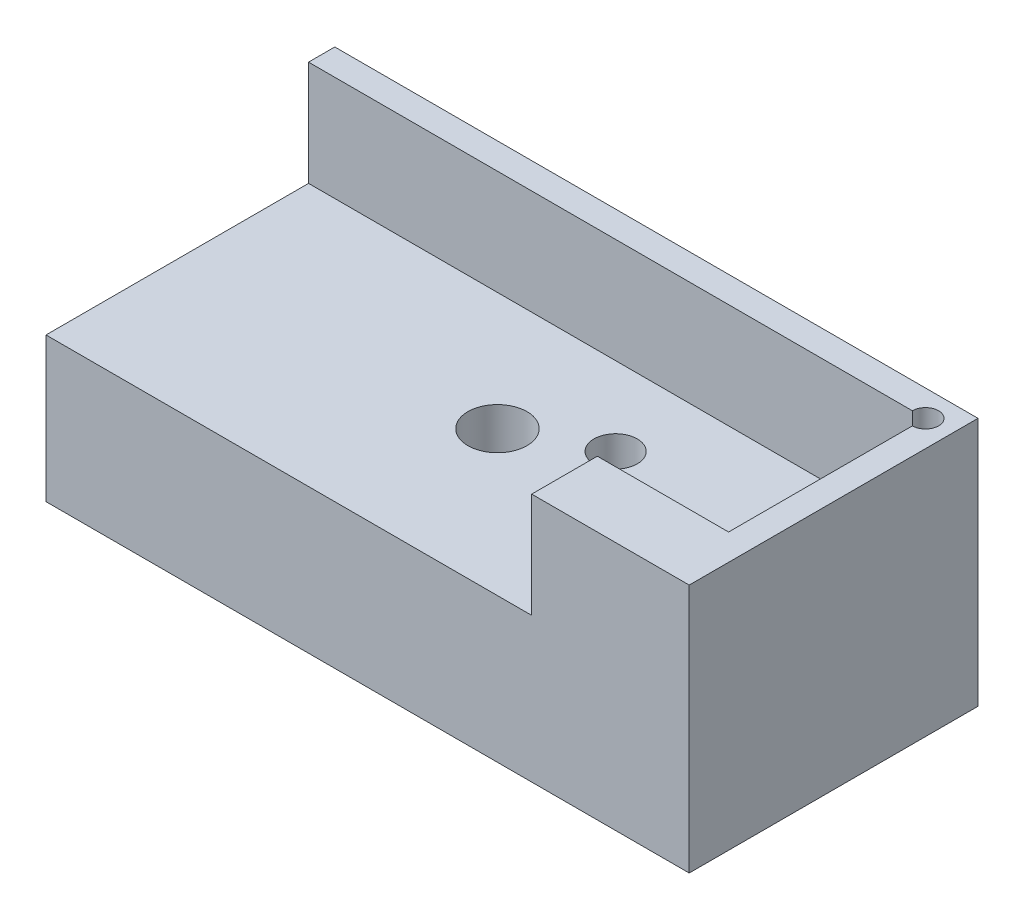
ISO-10303-21;
HEADER;
FILE_DESCRIPTION(('STEP AP214'),'2;1');
FILE_NAME('part.step','',(''),(''),'','','');
FILE_SCHEMA(('AUTOMOTIVE_DESIGN { 1 0 10303 214 1 1 1 1 }'));
ENDSEC;
DATA;
#1=APPLICATION_CONTEXT('core data for automotive mechanical design processes');
#2=APPLICATION_PROTOCOL_DEFINITION('international standard','automotive_design',2000,#1);
#3=PRODUCT_CONTEXT('',#1,'mechanical');
#4=PRODUCT('Part','Part','',(#3));
#5=PRODUCT_RELATED_PRODUCT_CATEGORY('part','',(#4));
#6=PRODUCT_DEFINITION_FORMATION('','',#4);
#7=PRODUCT_DEFINITION_CONTEXT('part definition',#1,'design');
#8=PRODUCT_DEFINITION('design','',#6,#7);
#9=PRODUCT_DEFINITION_SHAPE('','',#8);
#10=(LENGTH_UNIT() NAMED_UNIT(*) SI_UNIT(.MILLI.,.METRE.));
#11=(NAMED_UNIT(*) PLANE_ANGLE_UNIT() SI_UNIT($,.RADIAN.));
#12=(NAMED_UNIT(*) SI_UNIT($,.STERADIAN.) SOLID_ANGLE_UNIT());
#13=UNCERTAINTY_MEASURE_WITH_UNIT(LENGTH_MEASURE(1.E-05),#10,'distance_accuracy_value','');
#14=(GEOMETRIC_REPRESENTATION_CONTEXT(3) GLOBAL_UNCERTAINTY_ASSIGNED_CONTEXT((#13)) GLOBAL_UNIT_ASSIGNED_CONTEXT((#10,
#11,#12)) REPRESENTATION_CONTEXT('',''));
#15=CARTESIAN_POINT('',(0.,0.,0.));
#16=DIRECTION('',(0.,0.,1.));
#17=DIRECTION('',(1.,0.,0.));
#18=AXIS2_PLACEMENT_3D('',#15,#16,#17);
#19=CARTESIAN_POINT('',(0.,6.,0.));
#20=DIRECTION('',(0.,1.,0.));
#21=DIRECTION('',(0.,0.,1.));
#22=AXIS2_PLACEMENT_3D('',#19,#20,#21);
#23=PLANE('',#22);
#24=CARTESIAN_POINT('',(5.87799999999999,6.,-3.01448924411358));
#25=DIRECTION('',(0.,1.,0.));
#26=DIRECTION('',(0.,0.,1.));
#27=AXIS2_PLACEMENT_3D('',#24,#25,#26);
#28=CIRCLE('',#27,1.65);
#29=CARTESIAN_POINT('',(5.87799999999999,6.,-1.36448924411358));
#30=VERTEX_POINT('',#29);
#31=EDGE_CURVE('E183',#30,#30,#28,.T.);
#32=ORIENTED_EDGE('',*,*,#31,.F.);
#33=EDGE_LOOP('',(#32));
#34=FACE_BOUND('',#33,.T.);
#35=CARTESIAN_POINT('',(-0.121999999999988,6.,-0.0144892441135873));
#36=DIRECTION('',(0.,1.,0.));
#37=DIRECTION('',(0.,0.,1.));
#38=AXIS2_PLACEMENT_3D('',#35,#36,#37);
#39=CIRCLE('',#38,2.25);
#40=CARTESIAN_POINT('',(-0.121999999999988,6.,2.23551075588641));
#41=VERTEX_POINT('',#40);
#42=EDGE_CURVE('E157',#41,#41,#39,.T.);
#43=ORIENTED_EDGE('',*,*,#42,.F.);
#44=EDGE_LOOP('',(#43));
#45=FACE_BOUND('',#44,.T.);
#46=DIRECTION('',(0.,0.,-1.));
#47=VECTOR('',#46,1.);
#48=CARTESIAN_POINT('',(23.5,6.,-9.));
#49=LINE('',#48,#47);
#50=CARTESIAN_POINT('',(23.5,6.,6.));
#51=VERTEX_POINT('',#50);
#52=CARTESIAN_POINT('',(23.5,6.,-8.));
#53=VERTEX_POINT('',#52);
#54=EDGE_CURVE('E260',#51,#53,#49,.T.);
#55=ORIENTED_EDGE('',*,*,#54,.T.);
#56=CARTESIAN_POINT('',(23.5,6.,-9.));
#57=DIRECTION('',(0.,1.,0.));
#58=DIRECTION('',(0.,0.,1.));
#59=AXIS2_PLACEMENT_3D('',#56,#57,#58);
#60=CIRCLE('',#59,1.);
#61=CARTESIAN_POINT('',(22.5,6.,-9.));
#62=VERTEX_POINT('',#61);
#63=EDGE_CURVE('E201',#62,#53,#60,.F.);
#64=ORIENTED_EDGE('',*,*,#63,.F.);
#65=DIRECTION('',(-1.,0.,0.));
#66=VECTOR('',#65,1.);
#67=CARTESIAN_POINT('',(-23.5,6.,-9.));
#68=LINE('',#67,#66);
#69=CARTESIAN_POINT('',(-23.5,6.,-9.));
#70=VERTEX_POINT('',#69);
#71=EDGE_CURVE('E272',#62,#70,#68,.T.);
#72=ORIENTED_EDGE('',*,*,#71,.T.);
#73=DIRECTION('',(0.,0.,1.));
#74=VECTOR('',#73,1.);
#75=CARTESIAN_POINT('',(-23.5,6.,-9.));
#76=LINE('',#75,#74);
#77=CARTESIAN_POINT('',(-23.5,6.,11.));
#78=VERTEX_POINT('',#77);
#79=EDGE_CURVE('E274',#70,#78,#76,.T.);
#80=ORIENTED_EDGE('',*,*,#79,.T.);
#81=DIRECTION('',(-1.,0.,0.));
#82=VECTOR('',#81,1.);
#83=CARTESIAN_POINT('',(31.7462112512353,6.,11.));
#84=LINE('',#83,#82);
#85=CARTESIAN_POINT('',(13.5,6.,11.));
#86=VERTEX_POINT('',#85);
#87=EDGE_CURVE('E217',#86,#78,#84,.T.);
#88=ORIENTED_EDGE('',*,*,#87,.F.);
#89=DIRECTION('',(0.,0.,-1.));
#90=VECTOR('',#89,1.);
#91=CARTESIAN_POINT('',(13.5,6.,9.));
#92=LINE('',#91,#90);
#93=CARTESIAN_POINT('',(13.5,6.,6.));
#94=VERTEX_POINT('',#93);
#95=EDGE_CURVE('E224',#86,#94,#92,.T.);
#96=ORIENTED_EDGE('',*,*,#95,.T.);
#97=DIRECTION('',(-1.,0.,0.));
#98=VECTOR('',#97,1.);
#99=CARTESIAN_POINT('',(23.5,6.,6.));
#100=LINE('',#99,#98);
#101=EDGE_CURVE('E208',#51,#94,#100,.T.);
#102=ORIENTED_EDGE('',*,*,#101,.F.);
#103=EDGE_LOOP('',(#55,#64,#72,#80,#88,#96,#102));
#104=FACE_BOUND('',#103,.T.);
#105=ADVANCED_FACE('F40',(#34,#45,#104),#23,.T.);
#106=CARTESIAN_POINT('',(0.,14.,0.));
#107=DIRECTION('',(0.,1.,0.));
#108=DIRECTION('',(0.,0.,1.));
#109=AXIS2_PLACEMENT_3D('',#106,#107,#108);
#110=PLANE('',#109);
#111=CARTESIAN_POINT('',(23.5,14.,-9.));
#112=DIRECTION('',(0.,1.,0.));
#113=DIRECTION('',(0.,0.,1.));
#114=AXIS2_PLACEMENT_3D('',#111,#112,#113);
#115=CIRCLE('',#114,1.);
#116=CARTESIAN_POINT('',(23.5,14.,-8.));
#117=VERTEX_POINT('',#116);
#118=CARTESIAN_POINT('',(22.5,14.,-9.));
#119=VERTEX_POINT('',#118);
#120=EDGE_CURVE('E199',#117,#119,#115,.T.);
#121=ORIENTED_EDGE('',*,*,#120,.F.);
#122=DIRECTION('',(0.,0.,1.));
#123=VECTOR('',#122,1.);
#124=CARTESIAN_POINT('',(23.5,14.,9.));
#125=LINE('',#124,#123);
#126=CARTESIAN_POINT('',(23.5,14.,6.));
#127=VERTEX_POINT('',#126);
#128=EDGE_CURVE('E247',#117,#127,#125,.T.);
#129=ORIENTED_EDGE('',*,*,#128,.T.);
#130=DIRECTION('',(1.,0.,0.));
#131=VECTOR('',#130,1.);
#132=CARTESIAN_POINT('',(13.5,14.,6.));
#133=LINE('',#132,#131);
#134=CARTESIAN_POINT('',(13.5,14.,6.));
#135=VERTEX_POINT('',#134);
#136=EDGE_CURVE('E214',#135,#127,#133,.T.);
#137=ORIENTED_EDGE('',*,*,#136,.F.);
#138=DIRECTION('',(0.,0.,1.));
#139=VECTOR('',#138,1.);
#140=CARTESIAN_POINT('',(13.5,14.,9.));
#141=LINE('',#140,#139);
#142=CARTESIAN_POINT('',(13.5,14.,11.));
#143=VERTEX_POINT('',#142);
#144=EDGE_CURVE('E221',#135,#143,#141,.T.);
#145=ORIENTED_EDGE('',*,*,#144,.T.);
#146=DIRECTION('',(1.,0.,0.));
#147=VECTOR('',#146,1.);
#148=CARTESIAN_POINT('',(-23.5,14.,11.));
#149=LINE('',#148,#147);
#150=CARTESIAN_POINT('',(25.5,14.,11.));
#151=VERTEX_POINT('',#150);
#152=EDGE_CURVE('E249',#143,#151,#149,.T.);
#153=ORIENTED_EDGE('',*,*,#152,.T.);
#154=DIRECTION('',(0.,0.,-1.));
#155=VECTOR('',#154,1.);
#156=CARTESIAN_POINT('',(25.5,14.,11.));
#157=LINE('',#156,#155);
#158=CARTESIAN_POINT('',(25.5,14.,-11.));
#159=VERTEX_POINT('',#158);
#160=EDGE_CURVE('E251',#151,#159,#157,.T.);
#161=ORIENTED_EDGE('',*,*,#160,.T.);
#162=DIRECTION('',(-1.,0.,0.));
#163=VECTOR('',#162,1.);
#164=CARTESIAN_POINT('',(25.5,14.,-11.));
#165=LINE('',#164,#163);
#166=CARTESIAN_POINT('',(-23.5,14.,-11.));
#167=VERTEX_POINT('',#166);
#168=EDGE_CURVE('E254',#159,#167,#165,.T.);
#169=ORIENTED_EDGE('',*,*,#168,.T.);
#170=DIRECTION('',(0.,0.,1.));
#171=VECTOR('',#170,1.);
#172=CARTESIAN_POINT('',(-23.5,14.,-9.));
#173=LINE('',#172,#171);
#174=CARTESIAN_POINT('',(-23.5,14.,-9.));
#175=VERTEX_POINT('',#174);
#176=EDGE_CURVE('E241',#167,#175,#173,.T.);
#177=ORIENTED_EDGE('',*,*,#176,.T.);
#178=DIRECTION('',(1.,0.,0.));
#179=VECTOR('',#178,1.);
#180=CARTESIAN_POINT('',(23.5,14.,-9.));
#181=LINE('',#180,#179);
#182=EDGE_CURVE('E244',#175,#119,#181,.T.);
#183=ORIENTED_EDGE('',*,*,#182,.T.);
#184=EDGE_LOOP('',(#121,#129,#137,#145,#153,#161,#169,#177,#183));
#185=FACE_BOUND('',#184,.T.);
#186=ADVANCED_FACE('F313',(#185),#110,.T.);
#187=CARTESIAN_POINT('',(-23.5,6.,-9.));
#188=DIRECTION('',(1.,0.,0.));
#189=DIRECTION('',(0.,0.,-1.));
#190=AXIS2_PLACEMENT_3D('',#187,#188,#189);
#191=PLANE('',#190);
#192=DIRECTION('',(0.,1.,0.));
#193=VECTOR('',#192,1.);
#194=CARTESIAN_POINT('',(-23.5,0.,11.));
#195=LINE('',#194,#193);
#196=CARTESIAN_POINT('',(-23.5,-5.,11.));
#197=VERTEX_POINT('',#196);
#198=EDGE_CURVE('E266',#197,#78,#195,.T.);
#199=ORIENTED_EDGE('',*,*,#198,.T.);
#200=ORIENTED_EDGE('',*,*,#79,.F.);
#201=DIRECTION('',(0.,1.,0.));
#202=VECTOR('',#201,1.);
#203=CARTESIAN_POINT('',(-23.5,0.,-9.));
#204=LINE('',#203,#202);
#205=EDGE_CURVE('E257',#70,#175,#204,.T.);
#206=ORIENTED_EDGE('',*,*,#205,.T.);
#207=ORIENTED_EDGE('',*,*,#176,.F.);
#208=DIRECTION('',(0.,1.,0.));
#209=VECTOR('',#208,1.);
#210=CARTESIAN_POINT('',(-23.5,0.,-11.));
#211=LINE('',#210,#209);
#212=CARTESIAN_POINT('',(-23.5,-5.,-11.));
#213=VERTEX_POINT('',#212);
#214=EDGE_CURVE('E258',#213,#167,#211,.T.);
#215=ORIENTED_EDGE('',*,*,#214,.F.);
#216=DIRECTION('',(0.,0.,1.));
#217=VECTOR('',#216,1.);
#218=CARTESIAN_POINT('',(-23.5,-5.,-11.));
#219=LINE('',#218,#217);
#220=EDGE_CURVE('E235',#213,#197,#219,.T.);
#221=ORIENTED_EDGE('',*,*,#220,.T.);
#222=EDGE_LOOP('',(#199,#200,#206,#207,#215,#221));
#223=FACE_BOUND('',#222,.T.);
#224=ADVANCED_FACE('F319',(#223),#191,.F.);
#225=CARTESIAN_POINT('',(25.5,0.,-11.));
#226=DIRECTION('',(0.,0.,-1.));
#227=DIRECTION('',(-1.,0.,0.));
#228=AXIS2_PLACEMENT_3D('',#225,#226,#227);
#229=PLANE('',#228);
#230=DIRECTION('',(0.,-1.,0.));
#231=VECTOR('',#230,1.);
#232=CARTESIAN_POINT('',(18.878,-2.15599999999999,-11.));
#233=LINE('',#232,#231);
#234=CARTESIAN_POINT('',(18.878,-2.15599999999999,-11.));
#235=VERTEX_POINT('',#234);
#236=CARTESIAN_POINT('',(18.878,-5.,-11.));
#237=VERTEX_POINT('',#236);
#238=EDGE_CURVE('E166',#235,#237,#233,.T.);
#239=ORIENTED_EDGE('',*,*,#238,.F.);
#240=DIRECTION('',(1.,0.,0.));
#241=VECTOR('',#240,1.);
#242=CARTESIAN_POINT('',(25.5,-2.15599999999999,-11.));
#243=LINE('',#242,#241);
#244=CARTESIAN_POINT('',(-6.62200000000001,-2.15599999999999,-11.));
#245=VERTEX_POINT('',#244);
#246=EDGE_CURVE('E279',#245,#235,#243,.T.);
#247=ORIENTED_EDGE('',*,*,#246,.F.);
#248=DIRECTION('',(0.,1.,0.));
#249=VECTOR('',#248,1.);
#250=CARTESIAN_POINT('',(-6.62200000000001,0.,-11.));
#251=LINE('',#250,#249);
#252=CARTESIAN_POINT('',(-6.62200000000001,-5.,-11.));
#253=VERTEX_POINT('',#252);
#254=EDGE_CURVE('E196',#253,#245,#251,.T.);
#255=ORIENTED_EDGE('',*,*,#254,.F.);
#256=DIRECTION('',(-1.,0.,0.));
#257=VECTOR('',#256,1.);
#258=CARTESIAN_POINT('',(25.5,-5.,-11.));
#259=LINE('',#258,#257);
#260=EDGE_CURVE('E231',#253,#213,#259,.T.);
#261=ORIENTED_EDGE('',*,*,#260,.T.);
#262=ORIENTED_EDGE('',*,*,#214,.T.);
#263=ORIENTED_EDGE('',*,*,#168,.F.);
#264=DIRECTION('',(0.,1.,0.));
#265=VECTOR('',#264,1.);
#266=CARTESIAN_POINT('',(25.5,0.,-11.));
#267=LINE('',#266,#265);
#268=CARTESIAN_POINT('',(25.5,-5.,-11.));
#269=VERTEX_POINT('',#268);
#270=EDGE_CURVE('E261',#269,#159,#267,.T.);
#271=ORIENTED_EDGE('',*,*,#270,.F.);
#272=EDGE_CURVE('E232',#269,#237,#259,.T.);
#273=ORIENTED_EDGE('',*,*,#272,.T.);
#274=EDGE_LOOP('',(#239,#247,#255,#261,#262,#263,#271,#273));
#275=FACE_BOUND('',#274,.T.);
#276=ADVANCED_FACE('F304',(#275),#229,.T.);
#277=CARTESIAN_POINT('',(25.5,0.,11.));
#278=DIRECTION('',(1.,0.,0.));
#279=DIRECTION('',(0.,0.,-1.));
#280=AXIS2_PLACEMENT_3D('',#277,#278,#279);
#281=PLANE('',#280);
#282=ORIENTED_EDGE('',*,*,#270,.T.);
#283=ORIENTED_EDGE('',*,*,#160,.F.);
#284=DIRECTION('',(0.,1.,0.));
#285=VECTOR('',#284,1.);
#286=CARTESIAN_POINT('',(25.5,0.,11.));
#287=LINE('',#286,#285);
#288=CARTESIAN_POINT('',(25.5,-5.,11.));
#289=VERTEX_POINT('',#288);
#290=EDGE_CURVE('E263',#289,#151,#287,.T.);
#291=ORIENTED_EDGE('',*,*,#290,.F.);
#292=DIRECTION('',(0.,0.,-1.));
#293=VECTOR('',#292,1.);
#294=CARTESIAN_POINT('',(25.5,-5.,11.));
#295=LINE('',#294,#293);
#296=EDGE_CURVE('E228',#289,#269,#295,.T.);
#297=ORIENTED_EDGE('',*,*,#296,.T.);
#298=EDGE_LOOP('',(#282,#283,#291,#297));
#299=FACE_BOUND('',#298,.T.);
#300=ADVANCED_FACE('F332',(#299),#281,.T.);
#301=CARTESIAN_POINT('',(-23.5,0.,11.));
#302=DIRECTION('',(0.,0.,1.));
#303=DIRECTION('',(1.,0.,0.));
#304=AXIS2_PLACEMENT_3D('',#301,#302,#303);
#305=PLANE('',#304);
#306=ORIENTED_EDGE('',*,*,#87,.T.);
#307=ORIENTED_EDGE('',*,*,#198,.F.);
#308=DIRECTION('',(1.,0.,0.));
#309=VECTOR('',#308,1.);
#310=CARTESIAN_POINT('',(-23.5,-5.,11.));
#311=LINE('',#310,#309);
#312=EDGE_CURVE('E238',#197,#289,#311,.T.);
#313=ORIENTED_EDGE('',*,*,#312,.T.);
#314=ORIENTED_EDGE('',*,*,#290,.T.);
#315=ORIENTED_EDGE('',*,*,#152,.F.);
#316=DIRECTION('',(0.,-1.,0.));
#317=VECTOR('',#316,1.);
#318=CARTESIAN_POINT('',(13.5,6.,11.));
#319=LINE('',#318,#317);
#320=EDGE_CURVE('E218',#143,#86,#319,.T.);
#321=ORIENTED_EDGE('',*,*,#320,.T.);
#322=EDGE_LOOP('',(#306,#307,#313,#314,#315,#321));
#323=FACE_BOUND('',#322,.T.);
#324=ADVANCED_FACE('F340',(#323),#305,.T.);
#325=CARTESIAN_POINT('',(23.5,0.,9.));
#326=DIRECTION('',(-1.,0.,0.));
#327=DIRECTION('',(0.,0.,1.));
#328=AXIS2_PLACEMENT_3D('',#325,#326,#327);
#329=PLANE('',#328);
#330=DIRECTION('',(0.,1.,0.));
#331=VECTOR('',#330,1.);
#332=CARTESIAN_POINT('',(23.5,3.17157287525381,-8.));
#333=LINE('',#332,#331);
#334=EDGE_CURVE('E203',#53,#117,#333,.T.);
#335=ORIENTED_EDGE('',*,*,#334,.F.);
#336=ORIENTED_EDGE('',*,*,#54,.F.);
#337=DIRECTION('',(0.,-1.,0.));
#338=VECTOR('',#337,1.);
#339=CARTESIAN_POINT('',(23.5,14.,6.));
#340=LINE('',#339,#338);
#341=EDGE_CURVE('E205',#127,#51,#340,.T.);
#342=ORIENTED_EDGE('',*,*,#341,.F.);
#343=ORIENTED_EDGE('',*,*,#128,.F.);
#344=EDGE_LOOP('',(#335,#336,#342,#343));
#345=FACE_BOUND('',#344,.T.);
#346=ADVANCED_FACE('F356',(#345),#329,.T.);
#347=CARTESIAN_POINT('',(23.5,0.,-9.));
#348=DIRECTION('',(0.,0.,1.));
#349=DIRECTION('',(1.,0.,0.));
#350=AXIS2_PLACEMENT_3D('',#347,#348,#349);
#351=PLANE('',#350);
#352=DIRECTION('',(0.,1.,0.));
#353=VECTOR('',#352,1.);
#354=CARTESIAN_POINT('',(22.5,3.17157287525381,-9.));
#355=LINE('',#354,#353);
#356=EDGE_CURVE('E276',#119,#62,#355,.F.);
#357=ORIENTED_EDGE('',*,*,#356,.F.);
#358=ORIENTED_EDGE('',*,*,#182,.F.);
#359=ORIENTED_EDGE('',*,*,#205,.F.);
#360=ORIENTED_EDGE('',*,*,#71,.F.);
#361=EDGE_LOOP('',(#357,#358,#359,#360));
#362=FACE_BOUND('',#361,.T.);
#363=ADVANCED_FACE('F325',(#362),#351,.T.);
#364=CARTESIAN_POINT('',(0.,-5.,0.));
#365=DIRECTION('',(0.,1.,0.));
#366=DIRECTION('',(0.,0.,1.));
#367=AXIS2_PLACEMENT_3D('',#364,#365,#366);
#368=PLANE('',#367);
#369=DIRECTION('',(0.,0.,-1.));
#370=VECTOR('',#369,1.);
#371=CARTESIAN_POINT('',(-6.62200000000001,-5.,9.48551075588642));
#372=LINE('',#371,#370);
#373=CARTESIAN_POINT('',(-6.62200000000001,-5.,8.48551075588642));
#374=VERTEX_POINT('',#373);
#375=EDGE_CURVE('E156',#374,#253,#372,.T.);
#376=ORIENTED_EDGE('',*,*,#375,.F.);
#377=CARTESIAN_POINT('',(-6.62200000000001,-5.,9.48551075588642));
#378=DIRECTION('',(0.,-1.,0.));
#379=DIRECTION('',(0.,0.,-1.));
#380=AXIS2_PLACEMENT_3D('',#377,#378,#379);
#381=CIRCLE('',#380,0.999999999999999);
#382=CARTESIAN_POINT('',(-5.62200000000002,-5.,9.48551075588642));
#383=VERTEX_POINT('',#382);
#384=EDGE_CURVE('E162',#383,#374,#381,.T.);
#385=ORIENTED_EDGE('',*,*,#384,.F.);
#386=DIRECTION('',(-1.,0.,0.));
#387=VECTOR('',#386,1.);
#388=CARTESIAN_POINT('',(-6.62200000000001,-5.,9.48551075588642));
#389=LINE('',#388,#387);
#390=CARTESIAN_POINT('',(17.878,-5.,9.48551075588642));
#391=VERTEX_POINT('',#390);
#392=EDGE_CURVE('E149',#391,#383,#389,.T.);
#393=ORIENTED_EDGE('',*,*,#392,.F.);
#394=CARTESIAN_POINT('',(17.878,-5.,8.48551075588642));
#395=DIRECTION('',(0.,1.,0.));
#396=DIRECTION('',(0.,0.,1.));
#397=AXIS2_PLACEMENT_3D('',#394,#395,#396);
#398=CIRCLE('',#397,1.);
#399=CARTESIAN_POINT('',(18.878,-5.,8.48551075588642));
#400=VERTEX_POINT('',#399);
#401=EDGE_CURVE('E13',#391,#400,#398,.T.);
#402=ORIENTED_EDGE('',*,*,#401,.T.);
#403=DIRECTION('',(0.,0.,1.));
#404=VECTOR('',#403,1.);
#405=CARTESIAN_POINT('',(18.878,-5.,-11.));
#406=LINE('',#405,#404);
#407=EDGE_CURVE('E175',#237,#400,#406,.T.);
#408=ORIENTED_EDGE('',*,*,#407,.F.);
#409=ORIENTED_EDGE('',*,*,#272,.F.);
#410=ORIENTED_EDGE('',*,*,#296,.F.);
#411=ORIENTED_EDGE('',*,*,#312,.F.);
#412=ORIENTED_EDGE('',*,*,#220,.F.);
#413=ORIENTED_EDGE('',*,*,#260,.F.);
#414=EDGE_LOOP('',(#376,#385,#393,#402,#408,#409,#410,#411,#412,#413));
#415=FACE_BOUND('',#414,.T.);
#416=ADVANCED_FACE('F169',(#415),#368,.F.);
#417=CARTESIAN_POINT('',(13.5,0.,9.));
#418=DIRECTION('',(-1.,0.,0.));
#419=DIRECTION('',(0.,0.,1.));
#420=AXIS2_PLACEMENT_3D('',#417,#418,#419);
#421=PLANE('',#420);
#422=ORIENTED_EDGE('',*,*,#144,.F.);
#423=DIRECTION('',(0.,1.,0.));
#424=VECTOR('',#423,1.);
#425=CARTESIAN_POINT('',(13.5,6.,6.));
#426=LINE('',#425,#424);
#427=EDGE_CURVE('E211',#94,#135,#426,.T.);
#428=ORIENTED_EDGE('',*,*,#427,.F.);
#429=ORIENTED_EDGE('',*,*,#95,.F.);
#430=ORIENTED_EDGE('',*,*,#320,.F.);
#431=EDGE_LOOP('',(#422,#428,#429,#430));
#432=FACE_BOUND('',#431,.T.);
#433=ADVANCED_FACE('F346',(#432),#421,.T.);
#434=CARTESIAN_POINT('',(0.,0.,6.));
#435=DIRECTION('',(0.,0.,-1.));
#436=DIRECTION('',(-1.,0.,0.));
#437=AXIS2_PLACEMENT_3D('',#434,#435,#436);
#438=PLANE('',#437);
#439=ORIENTED_EDGE('',*,*,#341,.T.);
#440=ORIENTED_EDGE('',*,*,#101,.T.);
#441=ORIENTED_EDGE('',*,*,#427,.T.);
#442=ORIENTED_EDGE('',*,*,#136,.T.);
#443=EDGE_LOOP('',(#439,#440,#441,#442));
#444=FACE_BOUND('',#443,.T.);
#445=ADVANCED_FACE('F349',(#444),#438,.T.);
#446=CARTESIAN_POINT('',(23.5,3.17157287525381,-9.));
#447=DIRECTION('',(0.,1.,0.));
#448=DIRECTION('',(0.,0.,1.));
#449=AXIS2_PLACEMENT_3D('',#446,#447,#448);
#450=CYLINDRICAL_SURFACE('',#449,1.);
#451=ORIENTED_EDGE('',*,*,#334,.T.);
#452=ORIENTED_EDGE('',*,*,#120,.T.);
#453=ORIENTED_EDGE('',*,*,#356,.T.);
#454=ORIENTED_EDGE('',*,*,#63,.T.);
#455=EDGE_LOOP('',(#451,#452,#453,#454));
#456=FACE_BOUND('',#455,.T.);
#457=ADVANCED_FACE('F360',(#456),#450,.F.);
#458=CARTESIAN_POINT('',(18.3748,-2.15599999999999,-15.5112892441136));
#459=DIRECTION('',(0.,1.,0.));
#460=DIRECTION('',(1.,0.,0.));
#461=AXIS2_PLACEMENT_3D('',#458,#459,#460);
#462=PLANE('',#461);
#463=CARTESIAN_POINT('',(5.87799999999999,-2.15599999999999,-3.01448924411358));
#464=DIRECTION('',(0.,-1.,0.));
#465=DIRECTION('',(0.,0.,-1.));
#466=AXIS2_PLACEMENT_3D('',#463,#464,#465);
#467=CIRCLE('',#466,1.65);
#468=CARTESIAN_POINT('',(5.87799999999999,-2.15599999999999,-4.66448924411358));
#469=VERTEX_POINT('',#468);
#470=EDGE_CURVE('E180',#469,#469,#467,.T.);
#471=ORIENTED_EDGE('',*,*,#470,.F.);
#472=EDGE_LOOP('',(#471));
#473=FACE_BOUND('',#472,.T.);
#474=CARTESIAN_POINT('',(-0.121999999999988,-2.15599999999999,-0.0144892441135873));
#475=DIRECTION('',(0.,1.,0.));
#476=DIRECTION('',(0.,0.,1.));
#477=AXIS2_PLACEMENT_3D('',#474,#475,#476);
#478=CIRCLE('',#477,4.);
#479=CARTESIAN_POINT('',(-0.121999999999988,-2.15599999999999,3.98551075588641));
#480=VERTEX_POINT('',#479);
#481=EDGE_CURVE('E190',#480,#480,#478,.T.);
#482=ORIENTED_EDGE('',*,*,#481,.T.);
#483=EDGE_LOOP('',(#482));
#484=FACE_BOUND('',#483,.T.);
#485=DIRECTION('',(0.,0.,-1.));
#486=VECTOR('',#485,1.);
#487=CARTESIAN_POINT('',(18.878,-2.15599999999998,9.48551075588642));
#488=LINE('',#487,#486);
#489=CARTESIAN_POINT('',(18.878,-2.15599999999998,8.48551075588642));
#490=VERTEX_POINT('',#489);
#491=EDGE_CURVE('E178',#490,#235,#488,.T.);
#492=ORIENTED_EDGE('',*,*,#491,.F.);
#493=CARTESIAN_POINT('',(17.878,-2.15599999999999,8.48551075588642));
#494=DIRECTION('',(0.,1.,0.));
#495=DIRECTION('',(0.,0.,1.));
#496=AXIS2_PLACEMENT_3D('',#493,#494,#495);
#497=CIRCLE('',#496,1.);
#498=CARTESIAN_POINT('',(17.878,-2.15599999999998,9.48551075588642));
#499=VERTEX_POINT('',#498);
#500=EDGE_CURVE('E62',#490,#499,#497,.F.);
#501=ORIENTED_EDGE('',*,*,#500,.T.);
#502=DIRECTION('',(-1.,0.,0.));
#503=VECTOR('',#502,1.);
#504=CARTESIAN_POINT('',(-6.62200000000001,-2.15599999999998,9.48551075588642));
#505=LINE('',#504,#503);
#506=CARTESIAN_POINT('',(-5.62200000000002,-2.15599999999999,9.48551075588642));
#507=VERTEX_POINT('',#506);
#508=EDGE_CURVE('E191',#499,#507,#505,.T.);
#509=ORIENTED_EDGE('',*,*,#508,.T.);
#510=CARTESIAN_POINT('',(-6.62200000000001,-2.15599999999999,9.48551075588642));
#511=DIRECTION('',(0.,1.,0.));
#512=DIRECTION('',(0.,0.,1.));
#513=AXIS2_PLACEMENT_3D('',#510,#511,#512);
#514=CIRCLE('',#513,0.999999999999999);
#515=CARTESIAN_POINT('',(-6.62200000000001,-2.15599999999999,8.48551075588642));
#516=VERTEX_POINT('',#515);
#517=EDGE_CURVE('E165',#507,#516,#514,.F.);
#518=ORIENTED_EDGE('',*,*,#517,.T.);
#519=DIRECTION('',(0.,0.,-1.));
#520=VECTOR('',#519,1.);
#521=CARTESIAN_POINT('',(-6.62200000000001,-2.15599999999998,9.48551075588643));
#522=LINE('',#521,#520);
#523=EDGE_CURVE('E194',#516,#245,#522,.T.);
#524=ORIENTED_EDGE('',*,*,#523,.T.);
#525=ORIENTED_EDGE('',*,*,#246,.T.);
#526=EDGE_LOOP('',(#492,#501,#509,#518,#524,#525));
#527=FACE_BOUND('',#526,.T.);
#528=ADVANCED_FACE('F298',(#473,#484,#527),#462,.F.);
#529=CARTESIAN_POINT('',(-6.62200000000001,33.1993390593274,9.48551075588642));
#530=DIRECTION('',(0.,0.,1.));
#531=DIRECTION('',(1.,0.,0.));
#532=AXIS2_PLACEMENT_3D('',#529,#530,#531);
#533=PLANE('',#532);
#534=ORIENTED_EDGE('',*,*,#508,.F.);
#535=DIRECTION('',(0.,1.,0.));
#536=VECTOR('',#535,1.);
#537=CARTESIAN_POINT('',(17.878,33.1993390593274,9.48551075588642));
#538=LINE('',#537,#536);
#539=EDGE_CURVE('E48',#499,#391,#538,.F.);
#540=ORIENTED_EDGE('',*,*,#539,.T.);
#541=ORIENTED_EDGE('',*,*,#392,.T.);
#542=DIRECTION('',(0.,-1.,0.));
#543=VECTOR('',#542,1.);
#544=CARTESIAN_POINT('',(-5.62200000000002,0.6724271247462,9.48551075588642));
#545=LINE('',#544,#543);
#546=EDGE_CURVE('E152',#383,#507,#545,.F.);
#547=ORIENTED_EDGE('',*,*,#546,.T.);
#548=EDGE_LOOP('',(#534,#540,#541,#547));
#549=FACE_BOUND('',#548,.T.);
#550=ADVANCED_FACE('F151',(#549),#533,.F.);
#551=CARTESIAN_POINT('',(-6.62200000000001,33.1993390593274,9.48551075588642));
#552=DIRECTION('',(-1.,0.,0.));
#553=DIRECTION('',(0.,0.,1.));
#554=AXIS2_PLACEMENT_3D('',#551,#552,#553);
#555=PLANE('',#554);
#556=ORIENTED_EDGE('',*,*,#523,.F.);
#557=DIRECTION('',(0.,-1.,0.));
#558=VECTOR('',#557,1.);
#559=CARTESIAN_POINT('',(-6.62200000000001,0.6724271247462,8.48551075588642));
#560=LINE('',#559,#558);
#561=EDGE_CURVE('E282',#516,#374,#560,.T.);
#562=ORIENTED_EDGE('',*,*,#561,.T.);
#563=ORIENTED_EDGE('',*,*,#375,.T.);
#564=ORIENTED_EDGE('',*,*,#254,.T.);
#565=EDGE_LOOP('',(#556,#562,#563,#564));
#566=FACE_BOUND('',#565,.T.);
#567=ADVANCED_FACE('F395',(#566),#555,.F.);
#568=CARTESIAN_POINT('',(-0.121999999999988,-5.,-0.0144892441135873));
#569=DIRECTION('',(0.,-1.,0.));
#570=DIRECTION('',(0.,0.,-1.));
#571=AXIS2_PLACEMENT_3D('',#568,#569,#570);
#572=CYLINDRICAL_SURFACE('',#571,4.);
#573=CARTESIAN_POINT('',(-0.121999999999988,-0.399999999999999,-0.0144892441135873));
#574=DIRECTION('',(0.,-1.,0.));
#575=DIRECTION('',(0.,0.,-1.));
#576=AXIS2_PLACEMENT_3D('',#573,#574,#575);
#577=CIRCLE('',#576,4.);
#578=CARTESIAN_POINT('',(-0.121999999999988,-0.399999999999999,-4.01448924411359));
#579=VERTEX_POINT('',#578);
#580=EDGE_CURVE('E184',#579,#579,#577,.T.);
#581=ORIENTED_EDGE('',*,*,#580,.F.);
#582=EDGE_LOOP('',(#581));
#583=FACE_BOUND('',#582,.T.);
#584=ORIENTED_EDGE('',*,*,#481,.F.);
#585=EDGE_LOOP('',(#584));
#586=FACE_BOUND('',#585,.T.);
#587=ADVANCED_FACE('F398',(#583,#586),#572,.F.);
#588=CARTESIAN_POINT('',(-0.121999999999988,-5.,-0.0144892441135873));
#589=DIRECTION('',(0.,-1.,0.));
#590=DIRECTION('',(0.,0.,-1.));
#591=AXIS2_PLACEMENT_3D('',#588,#589,#590);
#592=CYLINDRICAL_SURFACE('',#591,2.25);
#593=ORIENTED_EDGE('',*,*,#42,.T.);
#594=EDGE_LOOP('',(#593));
#595=FACE_BOUND('',#594,.T.);
#596=CARTESIAN_POINT('',(-0.121999999999988,-0.399999999999999,-0.0144892441135873));
#597=DIRECTION('',(0.,-1.,0.));
#598=DIRECTION('',(0.,0.,-1.));
#599=AXIS2_PLACEMENT_3D('',#596,#597,#598);
#600=CIRCLE('',#599,2.25);
#601=CARTESIAN_POINT('',(-0.121999999999988,-0.399999999999999,-2.26448924411359));
#602=VERTEX_POINT('',#601);
#603=EDGE_CURVE('E187',#602,#602,#600,.T.);
#604=ORIENTED_EDGE('',*,*,#603,.T.);
#605=EDGE_LOOP('',(#604));
#606=FACE_BOUND('',#605,.T.);
#607=ADVANCED_FACE('F400',(#595,#606),#592,.F.);
#608=CARTESIAN_POINT('',(2.12800000000001,-0.399999999999999,-0.0144892441135873));
#609=DIRECTION('',(0.,1.,0.));
#610=DIRECTION('',(0.,0.,1.));
#611=AXIS2_PLACEMENT_3D('',#608,#609,#610);
#612=PLANE('',#611);
#613=ORIENTED_EDGE('',*,*,#603,.F.);
#614=EDGE_LOOP('',(#613));
#615=FACE_BOUND('',#614,.T.);
#616=ORIENTED_EDGE('',*,*,#580,.T.);
#617=EDGE_LOOP('',(#616));
#618=FACE_BOUND('',#617,.T.);
#619=ADVANCED_FACE('F403',(#615,#618),#612,.F.);
#620=CARTESIAN_POINT('',(5.87799999999999,-2.15599999999999,-3.01448924411358));
#621=DIRECTION('',(0.,-1.,0.));
#622=DIRECTION('',(0.,0.,-1.));
#623=AXIS2_PLACEMENT_3D('',#620,#621,#622);
#624=CYLINDRICAL_SURFACE('',#623,1.65);
#625=ORIENTED_EDGE('',*,*,#31,.T.);
#626=EDGE_LOOP('',(#625));
#627=FACE_BOUND('',#626,.T.);
#628=ORIENTED_EDGE('',*,*,#470,.T.);
#629=EDGE_LOOP('',(#628));
#630=FACE_BOUND('',#629,.T.);
#631=ADVANCED_FACE('F407',(#627,#630),#624,.F.);
#632=CARTESIAN_POINT('',(18.878,0.,0.));
#633=DIRECTION('',(-1.,0.,0.));
#634=DIRECTION('',(0.,0.,1.));
#635=AXIS2_PLACEMENT_3D('',#632,#633,#634);
#636=PLANE('',#635);
#637=ORIENTED_EDGE('',*,*,#407,.T.);
#638=DIRECTION('',(0.,1.,0.));
#639=VECTOR('',#638,1.);
#640=CARTESIAN_POINT('',(18.878,0.,8.48551075588642));
#641=LINE('',#640,#639);
#642=EDGE_CURVE('E290',#400,#490,#641,.T.);
#643=ORIENTED_EDGE('',*,*,#642,.T.);
#644=ORIENTED_EDGE('',*,*,#491,.T.);
#645=ORIENTED_EDGE('',*,*,#238,.T.);
#646=EDGE_LOOP('',(#637,#643,#644,#645));
#647=FACE_BOUND('',#646,.T.);
#648=ADVANCED_FACE('F295',(#647),#636,.T.);
#649=CARTESIAN_POINT('',(-6.62200000000001,0.6724271247462,9.48551075588642));
#650=DIRECTION('',(0.,-1.,0.));
#651=DIRECTION('',(0.,0.,-1.));
#652=AXIS2_PLACEMENT_3D('',#649,#650,#651);
#653=CYLINDRICAL_SURFACE('',#652,0.999999999999999);
#654=ORIENTED_EDGE('',*,*,#384,.T.);
#655=ORIENTED_EDGE('',*,*,#561,.F.);
#656=ORIENTED_EDGE('',*,*,#517,.F.);
#657=ORIENTED_EDGE('',*,*,#546,.F.);
#658=EDGE_LOOP('',(#654,#655,#656,#657));
#659=FACE_BOUND('',#658,.T.);
#660=ADVANCED_FACE('F161',(#659),#653,.F.);
#661=CARTESIAN_POINT('',(17.878,0.,8.48551075588642));
#662=DIRECTION('',(0.,1.,0.));
#663=DIRECTION('',(0.,0.,1.));
#664=AXIS2_PLACEMENT_3D('',#661,#662,#663);
#665=CYLINDRICAL_SURFACE('',#664,1.);
#666=ORIENTED_EDGE('',*,*,#401,.F.);
#667=ORIENTED_EDGE('',*,*,#539,.F.);
#668=ORIENTED_EDGE('',*,*,#500,.F.);
#669=ORIENTED_EDGE('',*,*,#642,.F.);
#670=EDGE_LOOP('',(#666,#667,#668,#669));
#671=FACE_BOUND('',#670,.T.);
#672=ADVANCED_FACE('F42',(#671),#665,.F.);
#673=CLOSED_SHELL('',(#105,#186,#224,#276,#300,#324,#346,#363,#416,#433,#445,#457,#528,#550,
#567,#587,#607,#619,#631,#648,#660,#672));
#674=MANIFOLD_SOLID_BREP('B2',#673);
#675=ADVANCED_BREP_SHAPE_REPRESENTATION('',(#18,#674),#14);
#676=SHAPE_DEFINITION_REPRESENTATION(#9,#675);
ENDSEC;
END-ISO-10303-21;
